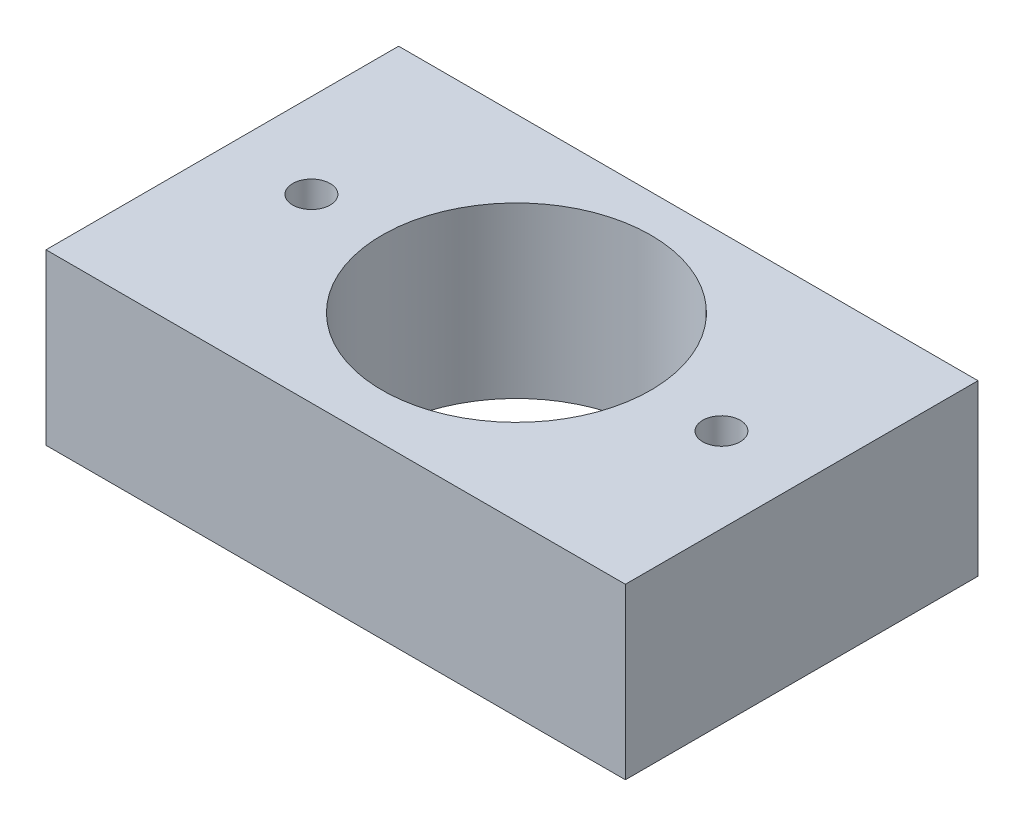
ISO-10303-21;
HEADER;
FILE_DESCRIPTION(('STEP AP214'),'2;1');
FILE_NAME('part.step','',(''),(''),'','','');
FILE_SCHEMA(('AUTOMOTIVE_DESIGN { 1 0 10303 214 1 1 1 1 }'));
ENDSEC;
DATA;
#1=APPLICATION_CONTEXT('core data for automotive mechanical design processes');
#2=APPLICATION_PROTOCOL_DEFINITION('international standard','automotive_design',2000,#1);
#3=PRODUCT_CONTEXT('',#1,'mechanical');
#4=PRODUCT('Part','Part','',(#3));
#5=PRODUCT_RELATED_PRODUCT_CATEGORY('part','',(#4));
#6=PRODUCT_DEFINITION_FORMATION('','',#4);
#7=PRODUCT_DEFINITION_CONTEXT('part definition',#1,'design');
#8=PRODUCT_DEFINITION('design','',#6,#7);
#9=PRODUCT_DEFINITION_SHAPE('','',#8);
#10=(LENGTH_UNIT() NAMED_UNIT(*) SI_UNIT(.MILLI.,.METRE.));
#11=(NAMED_UNIT(*) PLANE_ANGLE_UNIT() SI_UNIT($,.RADIAN.));
#12=(NAMED_UNIT(*) SI_UNIT($,.STERADIAN.) SOLID_ANGLE_UNIT());
#13=UNCERTAINTY_MEASURE_WITH_UNIT(LENGTH_MEASURE(1.E-05),#10,'distance_accuracy_value','');
#14=(GEOMETRIC_REPRESENTATION_CONTEXT(3) GLOBAL_UNCERTAINTY_ASSIGNED_CONTEXT((#13)) GLOBAL_UNIT_ASSIGNED_CONTEXT((#10,
#11,#12)) REPRESENTATION_CONTEXT('',''));
#15=CARTESIAN_POINT('',(0.,0.,0.));
#16=DIRECTION('',(0.,0.,1.));
#17=DIRECTION('',(1.,0.,0.));
#18=AXIS2_PLACEMENT_3D('',#15,#16,#17);
#19=CARTESIAN_POINT('',(-32.5,-19.,0.));
#20=DIRECTION('',(-1.,0.,0.));
#21=DIRECTION('',(0.,0.,1.));
#22=AXIS2_PLACEMENT_3D('',#19,#20,#21);
#23=PLANE('',#22);
#24=DIRECTION('',(0.,0.,1.));
#25=VECTOR('',#24,1.);
#26=CARTESIAN_POINT('',(-32.5,-19.,0.));
#27=LINE('',#26,#25);
#28=CARTESIAN_POINT('',(-32.5,-19.,-19.28));
#29=VERTEX_POINT('',#28);
#30=CARTESIAN_POINT('',(-32.5,-19.,20.28));
#31=VERTEX_POINT('',#30);
#32=EDGE_CURVE('E79',#29,#31,#27,.T.);
#33=ORIENTED_EDGE('',*,*,#32,.T.);
#34=DIRECTION('',(0.,1.,0.));
#35=VECTOR('',#34,1.);
#36=CARTESIAN_POINT('',(-32.5,-55.,20.28));
#37=LINE('',#36,#35);
#38=CARTESIAN_POINT('',(-32.5,0.,20.28));
#39=VERTEX_POINT('',#38);
#40=EDGE_CURVE('E49',#31,#39,#37,.T.);
#41=ORIENTED_EDGE('',*,*,#40,.T.);
#42=DIRECTION('',(0.,0.,1.));
#43=VECTOR('',#42,1.);
#44=CARTESIAN_POINT('',(-32.5,0.,0.));
#45=LINE('',#44,#43);
#46=CARTESIAN_POINT('',(-32.5,0.,-19.28));
#47=VERTEX_POINT('',#46);
#48=EDGE_CURVE('E93',#47,#39,#45,.T.);
#49=ORIENTED_EDGE('',*,*,#48,.F.);
#50=DIRECTION('',(0.,1.,0.));
#51=VECTOR('',#50,1.);
#52=CARTESIAN_POINT('',(-32.5,-19.,-19.28));
#53=LINE('',#52,#51);
#54=EDGE_CURVE('E11',#29,#47,#53,.T.);
#55=ORIENTED_EDGE('',*,*,#54,.F.);
#56=EDGE_LOOP('',(#33,#41,#49,#55));
#57=FACE_BOUND('',#56,.T.);
#58=ADVANCED_FACE('F17',(#57),#23,.T.);
#59=CARTESIAN_POINT('',(32.5,-19.,0.));
#60=DIRECTION('',(-1.,0.,0.));
#61=DIRECTION('',(0.,0.,1.));
#62=AXIS2_PLACEMENT_3D('',#59,#60,#61);
#63=PLANE('',#62);
#64=DIRECTION('',(0.,1.,0.));
#65=VECTOR('',#64,1.);
#66=CARTESIAN_POINT('',(32.5,-55.,20.28));
#67=LINE('',#66,#65);
#68=CARTESIAN_POINT('',(32.5,-19.,20.28));
#69=VERTEX_POINT('',#68);
#70=CARTESIAN_POINT('',(32.5,0.,20.28));
#71=VERTEX_POINT('',#70);
#72=EDGE_CURVE('E60',#69,#71,#67,.T.);
#73=ORIENTED_EDGE('',*,*,#72,.F.);
#74=DIRECTION('',(0.,0.,1.));
#75=VECTOR('',#74,1.);
#76=CARTESIAN_POINT('',(32.5,-19.,0.));
#77=LINE('',#76,#75);
#78=CARTESIAN_POINT('',(32.5,-19.,-19.28));
#79=VERTEX_POINT('',#78);
#80=EDGE_CURVE('E71',#79,#69,#77,.T.);
#81=ORIENTED_EDGE('',*,*,#80,.F.);
#82=DIRECTION('',(0.,1.,0.));
#83=VECTOR('',#82,1.);
#84=CARTESIAN_POINT('',(32.5,-19.,-19.28));
#85=LINE('',#84,#83);
#86=CARTESIAN_POINT('',(32.5,0.,-19.28));
#87=VERTEX_POINT('',#86);
#88=EDGE_CURVE('E27',#79,#87,#85,.T.);
#89=ORIENTED_EDGE('',*,*,#88,.T.);
#90=DIRECTION('',(0.,0.,1.));
#91=VECTOR('',#90,1.);
#92=CARTESIAN_POINT('',(32.5,0.,0.));
#93=LINE('',#92,#91);
#94=EDGE_CURVE('E74',#87,#71,#93,.T.);
#95=ORIENTED_EDGE('',*,*,#94,.T.);
#96=EDGE_LOOP('',(#73,#81,#89,#95));
#97=FACE_BOUND('',#96,.T.);
#98=ADVANCED_FACE('F19',(#97),#63,.F.);
#99=CARTESIAN_POINT('',(23.,-19.,0.));
#100=DIRECTION('',(0.,1.,0.));
#101=DIRECTION('',(0.,0.,1.));
#102=AXIS2_PLACEMENT_3D('',#99,#100,#101);
#103=CYLINDRICAL_SURFACE('',#102,2.1);
#104=CARTESIAN_POINT('',(23.,0.,0.));
#105=DIRECTION('',(0.,-1.,0.));
#106=DIRECTION('',(0.,0.,-1.));
#107=AXIS2_PLACEMENT_3D('',#104,#105,#106);
#108=CIRCLE('',#107,2.1);
#109=CARTESIAN_POINT('',(23.,0.,-2.1));
#110=VERTEX_POINT('',#109);
#111=EDGE_CURVE('E99',#110,#110,#108,.T.);
#112=ORIENTED_EDGE('',*,*,#111,.F.);
#113=EDGE_LOOP('',(#112));
#114=FACE_BOUND('',#113,.T.);
#115=CARTESIAN_POINT('',(23.,-9.,0.));
#116=DIRECTION('',(0.,-1.,0.));
#117=DIRECTION('',(0.,0.,-1.));
#118=AXIS2_PLACEMENT_3D('',#115,#116,#117);
#119=CIRCLE('',#118,2.1);
#120=CARTESIAN_POINT('',(23.,-9.,-2.1));
#121=VERTEX_POINT('',#120);
#122=EDGE_CURVE('E21',#121,#121,#119,.T.);
#123=ORIENTED_EDGE('',*,*,#122,.T.);
#124=EDGE_LOOP('',(#123));
#125=FACE_BOUND('',#124,.T.);
#126=ADVANCED_FACE('F149',(#114,#125),#103,.F.);
#127=CARTESIAN_POINT('',(-23.,-19.,0.));
#128=DIRECTION('',(0.,1.,0.));
#129=DIRECTION('',(0.,0.,1.));
#130=AXIS2_PLACEMENT_3D('',#127,#128,#129);
#131=CYLINDRICAL_SURFACE('',#130,2.1);
#132=CARTESIAN_POINT('',(-23.,0.,0.));
#133=DIRECTION('',(0.,-1.,0.));
#134=DIRECTION('',(0.,0.,-1.));
#135=AXIS2_PLACEMENT_3D('',#132,#133,#134);
#136=CIRCLE('',#135,2.1);
#137=CARTESIAN_POINT('',(-23.,0.,-2.1));
#138=VERTEX_POINT('',#137);
#139=EDGE_CURVE('E96',#138,#138,#136,.T.);
#140=ORIENTED_EDGE('',*,*,#139,.F.);
#141=EDGE_LOOP('',(#140));
#142=FACE_BOUND('',#141,.T.);
#143=CARTESIAN_POINT('',(-23.,-9.,0.));
#144=DIRECTION('',(0.,-1.,0.));
#145=DIRECTION('',(0.,0.,-1.));
#146=AXIS2_PLACEMENT_3D('',#143,#144,#145);
#147=CIRCLE('',#146,2.1);
#148=CARTESIAN_POINT('',(-23.,-9.,-2.1));
#149=VERTEX_POINT('',#148);
#150=EDGE_CURVE('E104',#149,#149,#147,.T.);
#151=ORIENTED_EDGE('',*,*,#150,.T.);
#152=EDGE_LOOP('',(#151));
#153=FACE_BOUND('',#152,.T.);
#154=ADVANCED_FACE('F151',(#142,#153),#131,.F.);
#155=CARTESIAN_POINT('',(0.,0.,0.49999999999999));
#156=DIRECTION('',(0.,-1.,0.));
#157=DIRECTION('',(1.,0.,0.));
#158=AXIS2_PLACEMENT_3D('',#155,#156,#157);
#159=PLANE('',#158);
#160=CARTESIAN_POINT('',(0.,0.,0.));
#161=DIRECTION('',(0.,-1.,0.));
#162=DIRECTION('',(0.,0.,-1.));
#163=AXIS2_PLACEMENT_3D('',#160,#161,#162);
#164=CIRCLE('',#163,15.075);
#165=CARTESIAN_POINT('',(0.,0.,-15.075));
#166=VERTEX_POINT('',#165);
#167=EDGE_CURVE('E84',#166,#166,#164,.T.);
#168=ORIENTED_EDGE('',*,*,#167,.T.);
#169=EDGE_LOOP('',(#168));
#170=FACE_BOUND('',#169,.T.);
#171=ORIENTED_EDGE('',*,*,#111,.T.);
#172=EDGE_LOOP('',(#171));
#173=FACE_BOUND('',#172,.T.);
#174=ORIENTED_EDGE('',*,*,#139,.T.);
#175=EDGE_LOOP('',(#174));
#176=FACE_BOUND('',#175,.T.);
#177=ORIENTED_EDGE('',*,*,#48,.T.);
#178=DIRECTION('',(1.,0.,0.));
#179=VECTOR('',#178,1.);
#180=CARTESIAN_POINT('',(0.,0.,20.28));
#181=LINE('',#180,#179);
#182=EDGE_CURVE('E170',#39,#71,#181,.T.);
#183=ORIENTED_EDGE('',*,*,#182,.T.);
#184=ORIENTED_EDGE('',*,*,#94,.F.);
#185=DIRECTION('',(-1.,0.,0.));
#186=VECTOR('',#185,1.);
#187=CARTESIAN_POINT('',(0.,0.,-19.28));
#188=LINE('',#187,#186);
#189=EDGE_CURVE('E80',#87,#47,#188,.T.);
#190=ORIENTED_EDGE('',*,*,#189,.T.);
#191=EDGE_LOOP('',(#177,#183,#184,#190));
#192=FACE_BOUND('',#191,.T.);
#193=ADVANCED_FACE('F154',(#170,#173,#176,#192),#159,.F.);
#194=CARTESIAN_POINT('',(0.,-19.,-19.28));
#195=DIRECTION('',(0.,0.,-1.));
#196=DIRECTION('',(-1.,0.,0.));
#197=AXIS2_PLACEMENT_3D('',#194,#195,#196);
#198=PLANE('',#197);
#199=ORIENTED_EDGE('',*,*,#189,.F.);
#200=ORIENTED_EDGE('',*,*,#88,.F.);
#201=DIRECTION('',(-1.,0.,0.));
#202=VECTOR('',#201,1.);
#203=CARTESIAN_POINT('',(0.,-19.,-19.28));
#204=LINE('',#203,#202);
#205=EDGE_CURVE('E66',#79,#29,#204,.T.);
#206=ORIENTED_EDGE('',*,*,#205,.T.);
#207=ORIENTED_EDGE('',*,*,#54,.T.);
#208=EDGE_LOOP('',(#199,#200,#206,#207));
#209=FACE_BOUND('',#208,.T.);
#210=ADVANCED_FACE('F139',(#209),#198,.T.);
#211=CARTESIAN_POINT('',(0.,-19.,0.));
#212=DIRECTION('',(0.,1.,0.));
#213=DIRECTION('',(0.,0.,1.));
#214=AXIS2_PLACEMENT_3D('',#211,#212,#213);
#215=CYLINDRICAL_SURFACE('',#214,15.075);
#216=CARTESIAN_POINT('',(0.,-19.,0.));
#217=DIRECTION('',(0.,-1.,0.));
#218=DIRECTION('',(0.,0.,-1.));
#219=AXIS2_PLACEMENT_3D('',#216,#217,#218);
#220=CIRCLE('',#219,15.075);
#221=CARTESIAN_POINT('',(0.,-19.,-15.075));
#222=VERTEX_POINT('',#221);
#223=EDGE_CURVE('E67',#222,#222,#220,.T.);
#224=ORIENTED_EDGE('',*,*,#223,.T.);
#225=EDGE_LOOP('',(#224));
#226=FACE_BOUND('',#225,.T.);
#227=ORIENTED_EDGE('',*,*,#167,.F.);
#228=EDGE_LOOP('',(#227));
#229=FACE_BOUND('',#228,.T.);
#230=ADVANCED_FACE('F128',(#226,#229),#215,.F.);
#231=CARTESIAN_POINT('',(0.,-19.,0.49999999999999));
#232=DIRECTION('',(0.,-1.,0.));
#233=DIRECTION('',(1.,0.,0.));
#234=AXIS2_PLACEMENT_3D('',#231,#232,#233);
#235=PLANE('',#234);
#236=CARTESIAN_POINT('',(23.,-19.,0.));
#237=DIRECTION('',(0.,-1.,0.));
#238=DIRECTION('',(0.,0.,-1.));
#239=AXIS2_PLACEMENT_3D('',#236,#237,#238);
#240=CIRCLE('',#239,6.);
#241=CARTESIAN_POINT('',(23.,-19.,-6.));
#242=VERTEX_POINT('',#241);
#243=EDGE_CURVE('E111',#242,#242,#240,.T.);
#244=ORIENTED_EDGE('',*,*,#243,.F.);
#245=EDGE_LOOP('',(#244));
#246=FACE_BOUND('',#245,.T.);
#247=CARTESIAN_POINT('',(-23.,-19.,0.));
#248=DIRECTION('',(0.,-1.,0.));
#249=DIRECTION('',(0.,0.,-1.));
#250=AXIS2_PLACEMENT_3D('',#247,#248,#249);
#251=CIRCLE('',#250,6.);
#252=CARTESIAN_POINT('',(-23.,-19.,-6.));
#253=VERTEX_POINT('',#252);
#254=EDGE_CURVE('E75',#253,#253,#251,.T.);
#255=ORIENTED_EDGE('',*,*,#254,.F.);
#256=EDGE_LOOP('',(#255));
#257=FACE_BOUND('',#256,.T.);
#258=ORIENTED_EDGE('',*,*,#32,.F.);
#259=ORIENTED_EDGE('',*,*,#205,.F.);
#260=ORIENTED_EDGE('',*,*,#80,.T.);
#261=DIRECTION('',(1.,0.,0.));
#262=VECTOR('',#261,1.);
#263=CARTESIAN_POINT('',(0.,-19.,20.28));
#264=LINE('',#263,#262);
#265=EDGE_CURVE('E57',#31,#69,#264,.T.);
#266=ORIENTED_EDGE('',*,*,#265,.F.);
#267=EDGE_LOOP('',(#258,#259,#260,#266));
#268=FACE_BOUND('',#267,.T.);
#269=ORIENTED_EDGE('',*,*,#223,.F.);
#270=EDGE_LOOP('',(#269));
#271=FACE_BOUND('',#270,.T.);
#272=ADVANCED_FACE('F77',(#246,#257,#268,#271),#235,.T.);
#273=CARTESIAN_POINT('',(-23.,-9.,0.));
#274=DIRECTION('',(0.,-1.,0.));
#275=DIRECTION('',(0.,0.,-1.));
#276=AXIS2_PLACEMENT_3D('',#273,#274,#275);
#277=CYLINDRICAL_SURFACE('',#276,6.);
#278=CARTESIAN_POINT('',(-23.,-9.,0.));
#279=DIRECTION('',(0.,-1.,0.));
#280=DIRECTION('',(0.,0.,-1.));
#281=AXIS2_PLACEMENT_3D('',#278,#279,#280);
#282=CIRCLE('',#281,6.);
#283=CARTESIAN_POINT('',(-23.,-9.,-6.));
#284=VERTEX_POINT('',#283);
#285=EDGE_CURVE('E116',#284,#284,#282,.T.);
#286=ORIENTED_EDGE('',*,*,#285,.F.);
#287=EDGE_LOOP('',(#286));
#288=FACE_BOUND('',#287,.T.);
#289=ORIENTED_EDGE('',*,*,#254,.T.);
#290=EDGE_LOOP('',(#289));
#291=FACE_BOUND('',#290,.T.);
#292=ADVANCED_FACE('F125',(#288,#291),#277,.F.);
#293=CARTESIAN_POINT('',(0.,-9.,0.499999999999987));
#294=DIRECTION('',(0.,-1.,0.));
#295=DIRECTION('',(1.,0.,0.));
#296=AXIS2_PLACEMENT_3D('',#293,#294,#295);
#297=PLANE('',#296);
#298=ORIENTED_EDGE('',*,*,#150,.F.);
#299=EDGE_LOOP('',(#298));
#300=FACE_BOUND('',#299,.T.);
#301=ORIENTED_EDGE('',*,*,#285,.T.);
#302=EDGE_LOOP('',(#301));
#303=FACE_BOUND('',#302,.T.);
#304=ADVANCED_FACE('F136',(#300,#303),#297,.T.);
#305=CARTESIAN_POINT('',(23.,-9.,0.));
#306=DIRECTION('',(0.,-1.,0.));
#307=DIRECTION('',(0.,0.,-1.));
#308=AXIS2_PLACEMENT_3D('',#305,#306,#307);
#309=CYLINDRICAL_SURFACE('',#308,6.);
#310=CARTESIAN_POINT('',(23.,-9.,0.));
#311=DIRECTION('',(0.,-1.,0.));
#312=DIRECTION('',(0.,0.,-1.));
#313=AXIS2_PLACEMENT_3D('',#310,#311,#312);
#314=CIRCLE('',#313,6.);
#315=CARTESIAN_POINT('',(23.,-9.,-6.));
#316=VERTEX_POINT('',#315);
#317=EDGE_CURVE('E106',#316,#316,#314,.T.);
#318=ORIENTED_EDGE('',*,*,#317,.F.);
#319=EDGE_LOOP('',(#318));
#320=FACE_BOUND('',#319,.T.);
#321=ORIENTED_EDGE('',*,*,#243,.T.);
#322=EDGE_LOOP('',(#321));
#323=FACE_BOUND('',#322,.T.);
#324=ADVANCED_FACE('F177',(#320,#323),#309,.F.);
#325=CARTESIAN_POINT('',(0.,-9.,0.499999999999987));
#326=DIRECTION('',(0.,-1.,0.));
#327=DIRECTION('',(1.,0.,0.));
#328=AXIS2_PLACEMENT_3D('',#325,#326,#327);
#329=PLANE('',#328);
#330=ORIENTED_EDGE('',*,*,#122,.F.);
#331=EDGE_LOOP('',(#330));
#332=FACE_BOUND('',#331,.T.);
#333=ORIENTED_EDGE('',*,*,#317,.T.);
#334=EDGE_LOOP('',(#333));
#335=FACE_BOUND('',#334,.T.);
#336=ADVANCED_FACE('F175',(#332,#335),#329,.T.);
#337=CARTESIAN_POINT('',(0.,0.999999999999987,20.28));
#338=DIRECTION('',(0.,0.,1.));
#339=DIRECTION('',(1.,0.,0.));
#340=AXIS2_PLACEMENT_3D('',#337,#338,#339);
#341=PLANE('',#340);
#342=ORIENTED_EDGE('',*,*,#40,.F.);
#343=ORIENTED_EDGE('',*,*,#265,.T.);
#344=ORIENTED_EDGE('',*,*,#72,.T.);
#345=ORIENTED_EDGE('',*,*,#182,.F.);
#346=EDGE_LOOP('',(#342,#343,#344,#345));
#347=FACE_BOUND('',#346,.T.);
#348=ADVANCED_FACE('F59',(#347),#341,.T.);
#349=CLOSED_SHELL('',(#58,#98,#126,#154,#193,#210,#230,#272,#292,#304,#324,#336,#348));
#350=MANIFOLD_SOLID_BREP('B1',#349);
#351=ADVANCED_BREP_SHAPE_REPRESENTATION('',(#18,#350),#14);
#352=SHAPE_DEFINITION_REPRESENTATION(#9,#351);
ENDSEC;
END-ISO-10303-21;
